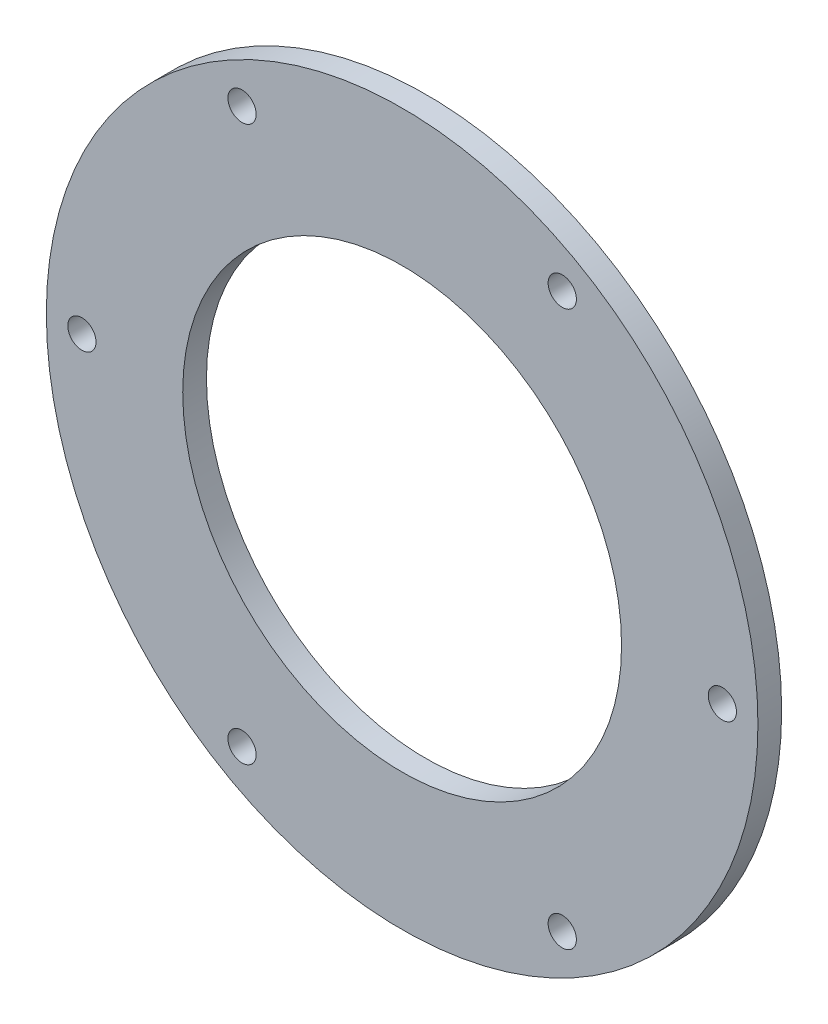
ISO-10303-21;
HEADER;
FILE_DESCRIPTION(('STEP AP214'),'2;1');
FILE_NAME('part.step','',(''),(''),'','','');
FILE_SCHEMA(('AUTOMOTIVE_DESIGN { 1 0 10303 214 1 1 1 1 }'));
ENDSEC;
DATA;
#1=APPLICATION_CONTEXT('core data for automotive mechanical design processes');
#2=APPLICATION_PROTOCOL_DEFINITION('international standard','automotive_design',2000,#1);
#3=PRODUCT_CONTEXT('',#1,'mechanical');
#4=PRODUCT('Part','Part','',(#3));
#5=PRODUCT_RELATED_PRODUCT_CATEGORY('part','',(#4));
#6=PRODUCT_DEFINITION_FORMATION('','',#4);
#7=PRODUCT_DEFINITION_CONTEXT('part definition',#1,'design');
#8=PRODUCT_DEFINITION('design','',#6,#7);
#9=PRODUCT_DEFINITION_SHAPE('','',#8);
#10=(LENGTH_UNIT() NAMED_UNIT(*) SI_UNIT(.MILLI.,.METRE.));
#11=(NAMED_UNIT(*) PLANE_ANGLE_UNIT() SI_UNIT($,.RADIAN.));
#12=(NAMED_UNIT(*) SI_UNIT($,.STERADIAN.) SOLID_ANGLE_UNIT());
#13=UNCERTAINTY_MEASURE_WITH_UNIT(LENGTH_MEASURE(1.E-05),#10,'distance_accuracy_value','');
#14=(GEOMETRIC_REPRESENTATION_CONTEXT(3) GLOBAL_UNCERTAINTY_ASSIGNED_CONTEXT((#13)) GLOBAL_UNIT_ASSIGNED_CONTEXT((#10,
#11,#12)) REPRESENTATION_CONTEXT('',''));
#15=CARTESIAN_POINT('',(0.,0.,0.));
#16=DIRECTION('',(0.,0.,1.));
#17=DIRECTION('',(1.,0.,0.));
#18=AXIS2_PLACEMENT_3D('',#15,#16,#17);
#19=CARTESIAN_POINT('',(0.,0.,4.));
#20=DIRECTION('',(0.,0.,1.));
#21=DIRECTION('',(1.,0.,0.));
#22=AXIS2_PLACEMENT_3D('',#19,#20,#21);
#23=PLANE('',#22);
#24=CARTESIAN_POINT('',(-54.,0.,4.));
#25=DIRECTION('',(0.,0.,1.));
#26=DIRECTION('',(1.,0.,0.));
#27=AXIS2_PLACEMENT_3D('',#24,#25,#26);
#28=CIRCLE('',#27,2.38125);
#29=CARTESIAN_POINT('',(-51.61875,0.,4.));
#30=VERTEX_POINT('',#29);
#31=EDGE_CURVE('E88',#30,#30,#28,.T.);
#32=ORIENTED_EDGE('',*,*,#31,.F.);
#33=EDGE_LOOP('',(#32));
#34=FACE_BOUND('',#33,.T.);
#35=CARTESIAN_POINT('',(54.,0.,4.));
#36=DIRECTION('',(0.,0.,1.));
#37=DIRECTION('',(1.,0.,0.));
#38=AXIS2_PLACEMENT_3D('',#35,#36,#37);
#39=CIRCLE('',#38,2.38125);
#40=CARTESIAN_POINT('',(56.38125,0.,4.));
#41=VERTEX_POINT('',#40);
#42=EDGE_CURVE('E82',#41,#41,#39,.T.);
#43=ORIENTED_EDGE('',*,*,#42,.F.);
#44=EDGE_LOOP('',(#43));
#45=FACE_BOUND('',#44,.T.);
#46=CARTESIAN_POINT('',(-26.9999999999999,46.7653718043597,4.));
#47=DIRECTION('',(0.,0.,1.));
#48=DIRECTION('',(1.,0.,0.));
#49=AXIS2_PLACEMENT_3D('',#46,#47,#48);
#50=CIRCLE('',#49,2.38125);
#51=CARTESIAN_POINT('',(-24.6187499999999,46.7653718043597,4.));
#52=VERTEX_POINT('',#51);
#53=EDGE_CURVE('E76',#52,#52,#50,.T.);
#54=ORIENTED_EDGE('',*,*,#53,.F.);
#55=EDGE_LOOP('',(#54));
#56=FACE_BOUND('',#55,.T.);
#57=CARTESIAN_POINT('',(-26.9999999999999,-46.7653718043598,4.));
#58=DIRECTION('',(0.,0.,1.));
#59=DIRECTION('',(1.,0.,0.));
#60=AXIS2_PLACEMENT_3D('',#57,#58,#59);
#61=CIRCLE('',#60,2.38125);
#62=CARTESIAN_POINT('',(-24.6187499999999,-46.7653718043598,4.));
#63=VERTEX_POINT('',#62);
#64=EDGE_CURVE('E70',#63,#63,#61,.T.);
#65=ORIENTED_EDGE('',*,*,#64,.F.);
#66=EDGE_LOOP('',(#65));
#67=FACE_BOUND('',#66,.T.);
#68=CARTESIAN_POINT('',(26.9999999999998,46.7653718043598,4.));
#69=DIRECTION('',(0.,0.,1.));
#70=DIRECTION('',(1.,0.,0.));
#71=AXIS2_PLACEMENT_3D('',#68,#69,#70);
#72=CIRCLE('',#71,2.38125);
#73=CARTESIAN_POINT('',(29.3812499999998,46.7653718043598,4.));
#74=VERTEX_POINT('',#73);
#75=EDGE_CURVE('E64',#74,#74,#72,.T.);
#76=ORIENTED_EDGE('',*,*,#75,.F.);
#77=EDGE_LOOP('',(#76));
#78=FACE_BOUND('',#77,.T.);
#79=CARTESIAN_POINT('',(26.9999999999998,-46.7653718043598,4.));
#80=DIRECTION('',(0.,0.,1.));
#81=DIRECTION('',(1.,0.,0.));
#82=AXIS2_PLACEMENT_3D('',#79,#80,#81);
#83=CIRCLE('',#82,2.38125);
#84=CARTESIAN_POINT('',(29.3812499999998,-46.7653718043598,4.));
#85=VERTEX_POINT('',#84);
#86=EDGE_CURVE('E58',#85,#85,#83,.T.);
#87=ORIENTED_EDGE('',*,*,#86,.F.);
#88=EDGE_LOOP('',(#87));
#89=FACE_BOUND('',#88,.T.);
#90=CARTESIAN_POINT('',(0.,0.,4.));
#91=DIRECTION('',(0.,0.,1.));
#92=DIRECTION('',(1.,0.,0.));
#93=AXIS2_PLACEMENT_3D('',#90,#91,#92);
#94=CIRCLE('',#93,60.);
#95=CARTESIAN_POINT('',(60.,0.,4.));
#96=VERTEX_POINT('',#95);
#97=EDGE_CURVE('E10',#96,#96,#94,.T.);
#98=ORIENTED_EDGE('',*,*,#97,.T.);
#99=EDGE_LOOP('',(#98));
#100=FACE_BOUND('',#99,.T.);
#101=CARTESIAN_POINT('',(0.,0.,4.));
#102=DIRECTION('',(0.,0.,1.));
#103=DIRECTION('',(1.,0.,0.));
#104=AXIS2_PLACEMENT_3D('',#101,#102,#103);
#105=CIRCLE('',#104,37.);
#106=CARTESIAN_POINT('',(37.,0.,4.));
#107=VERTEX_POINT('',#106);
#108=EDGE_CURVE('E48',#107,#107,#105,.T.);
#109=ORIENTED_EDGE('',*,*,#108,.F.);
#110=EDGE_LOOP('',(#109));
#111=FACE_BOUND('',#110,.T.);
#112=ADVANCED_FACE('F37',(#34,#45,#56,#67,#78,#89,#100,#111),#23,.T.);
#113=CARTESIAN_POINT('',(0.,0.,0.));
#114=DIRECTION('',(0.,0.,1.));
#115=DIRECTION('',(1.,0.,0.));
#116=AXIS2_PLACEMENT_3D('',#113,#114,#115);
#117=PLANE('',#116);
#118=CARTESIAN_POINT('',(-54.,0.,0.));
#119=DIRECTION('',(0.,0.,1.));
#120=DIRECTION('',(1.,0.,0.));
#121=AXIS2_PLACEMENT_3D('',#118,#119,#120);
#122=CIRCLE('',#121,2.38125);
#123=CARTESIAN_POINT('',(-51.61875,0.,0.));
#124=VERTEX_POINT('',#123);
#125=EDGE_CURVE('E85',#124,#124,#122,.T.);
#126=ORIENTED_EDGE('',*,*,#125,.T.);
#127=EDGE_LOOP('',(#126));
#128=FACE_BOUND('',#127,.T.);
#129=CARTESIAN_POINT('',(54.,0.,0.));
#130=DIRECTION('',(0.,0.,1.));
#131=DIRECTION('',(1.,0.,0.));
#132=AXIS2_PLACEMENT_3D('',#129,#130,#131);
#133=CIRCLE('',#132,2.38125);
#134=CARTESIAN_POINT('',(56.38125,0.,0.));
#135=VERTEX_POINT('',#134);
#136=EDGE_CURVE('E79',#135,#135,#133,.T.);
#137=ORIENTED_EDGE('',*,*,#136,.T.);
#138=EDGE_LOOP('',(#137));
#139=FACE_BOUND('',#138,.T.);
#140=CARTESIAN_POINT('',(-26.9999999999999,46.7653718043597,0.));
#141=DIRECTION('',(0.,0.,1.));
#142=DIRECTION('',(1.,0.,0.));
#143=AXIS2_PLACEMENT_3D('',#140,#141,#142);
#144=CIRCLE('',#143,2.38125);
#145=CARTESIAN_POINT('',(-24.6187499999999,46.7653718043597,0.));
#146=VERTEX_POINT('',#145);
#147=EDGE_CURVE('E73',#146,#146,#144,.T.);
#148=ORIENTED_EDGE('',*,*,#147,.T.);
#149=EDGE_LOOP('',(#148));
#150=FACE_BOUND('',#149,.T.);
#151=CARTESIAN_POINT('',(-26.9999999999999,-46.7653718043598,0.));
#152=DIRECTION('',(0.,0.,1.));
#153=DIRECTION('',(1.,0.,0.));
#154=AXIS2_PLACEMENT_3D('',#151,#152,#153);
#155=CIRCLE('',#154,2.38125);
#156=CARTESIAN_POINT('',(-24.6187499999999,-46.7653718043598,0.));
#157=VERTEX_POINT('',#156);
#158=EDGE_CURVE('E67',#157,#157,#155,.T.);
#159=ORIENTED_EDGE('',*,*,#158,.T.);
#160=EDGE_LOOP('',(#159));
#161=FACE_BOUND('',#160,.T.);
#162=CARTESIAN_POINT('',(26.9999999999998,46.7653718043598,0.));
#163=DIRECTION('',(0.,0.,1.));
#164=DIRECTION('',(1.,0.,0.));
#165=AXIS2_PLACEMENT_3D('',#162,#163,#164);
#166=CIRCLE('',#165,2.38125);
#167=CARTESIAN_POINT('',(29.3812499999998,46.7653718043598,0.));
#168=VERTEX_POINT('',#167);
#169=EDGE_CURVE('E61',#168,#168,#166,.T.);
#170=ORIENTED_EDGE('',*,*,#169,.T.);
#171=EDGE_LOOP('',(#170));
#172=FACE_BOUND('',#171,.T.);
#173=CARTESIAN_POINT('',(26.9999999999998,-46.7653718043598,0.));
#174=DIRECTION('',(0.,0.,1.));
#175=DIRECTION('',(1.,0.,0.));
#176=AXIS2_PLACEMENT_3D('',#173,#174,#175);
#177=CIRCLE('',#176,2.38125);
#178=CARTESIAN_POINT('',(29.3812499999998,-46.7653718043598,0.));
#179=VERTEX_POINT('',#178);
#180=EDGE_CURVE('E53',#179,#179,#177,.T.);
#181=ORIENTED_EDGE('',*,*,#180,.T.);
#182=EDGE_LOOP('',(#181));
#183=FACE_BOUND('',#182,.T.);
#184=CARTESIAN_POINT('',(0.,0.,0.));
#185=DIRECTION('',(0.,0.,1.));
#186=DIRECTION('',(1.,0.,0.));
#187=AXIS2_PLACEMENT_3D('',#184,#185,#186);
#188=CIRCLE('',#187,60.);
#189=CARTESIAN_POINT('',(60.,0.,0.));
#190=VERTEX_POINT('',#189);
#191=EDGE_CURVE('E41',#190,#190,#188,.T.);
#192=ORIENTED_EDGE('',*,*,#191,.F.);
#193=EDGE_LOOP('',(#192));
#194=FACE_BOUND('',#193,.T.);
#195=CARTESIAN_POINT('',(0.,0.,0.));
#196=DIRECTION('',(0.,0.,1.));
#197=DIRECTION('',(1.,0.,0.));
#198=AXIS2_PLACEMENT_3D('',#195,#196,#197);
#199=CIRCLE('',#198,37.);
#200=CARTESIAN_POINT('',(37.,0.,0.));
#201=VERTEX_POINT('',#200);
#202=EDGE_CURVE('E50',#201,#201,#199,.T.);
#203=ORIENTED_EDGE('',*,*,#202,.T.);
#204=EDGE_LOOP('',(#203));
#205=FACE_BOUND('',#204,.T.);
#206=ADVANCED_FACE('F96',(#128,#139,#150,#161,#172,#183,#194,#205),#117,.F.);
#207=CARTESIAN_POINT('',(0.,0.,4.));
#208=DIRECTION('',(0.,0.,-1.));
#209=DIRECTION('',(-1.,0.,0.));
#210=AXIS2_PLACEMENT_3D('',#207,#208,#209);
#211=CYLINDRICAL_SURFACE('',#210,60.);
#212=ORIENTED_EDGE('',*,*,#97,.F.);
#213=EDGE_LOOP('',(#212));
#214=FACE_BOUND('',#213,.T.);
#215=ORIENTED_EDGE('',*,*,#191,.T.);
#216=EDGE_LOOP('',(#215));
#217=FACE_BOUND('',#216,.T.);
#218=ADVANCED_FACE('F39',(#214,#217),#211,.T.);
#219=CARTESIAN_POINT('',(0.,0.,4.));
#220=DIRECTION('',(0.,0.,-1.));
#221=DIRECTION('',(-1.,0.,0.));
#222=AXIS2_PLACEMENT_3D('',#219,#220,#221);
#223=CYLINDRICAL_SURFACE('',#222,37.);
#224=ORIENTED_EDGE('',*,*,#108,.T.);
#225=EDGE_LOOP('',(#224));
#226=FACE_BOUND('',#225,.T.);
#227=ORIENTED_EDGE('',*,*,#202,.F.);
#228=EDGE_LOOP('',(#227));
#229=FACE_BOUND('',#228,.T.);
#230=ADVANCED_FACE('F110',(#226,#229),#223,.F.);
#231=CARTESIAN_POINT('',(26.9999999999998,-46.7653718043598,4.));
#232=DIRECTION('',(0.,0.,1.));
#233=DIRECTION('',(1.,0.,0.));
#234=AXIS2_PLACEMENT_3D('',#231,#232,#233);
#235=CYLINDRICAL_SURFACE('',#234,2.38125);
#236=ORIENTED_EDGE('',*,*,#180,.F.);
#237=EDGE_LOOP('',(#236));
#238=FACE_BOUND('',#237,.T.);
#239=ORIENTED_EDGE('',*,*,#86,.T.);
#240=EDGE_LOOP('',(#239));
#241=FACE_BOUND('',#240,.T.);
#242=ADVANCED_FACE('F113',(#238,#241),#235,.F.);
#243=CARTESIAN_POINT('',(26.9999999999998,46.7653718043598,4.));
#244=DIRECTION('',(0.,0.,1.));
#245=DIRECTION('',(1.,0.,0.));
#246=AXIS2_PLACEMENT_3D('',#243,#244,#245);
#247=CYLINDRICAL_SURFACE('',#246,2.38125);
#248=ORIENTED_EDGE('',*,*,#169,.F.);
#249=EDGE_LOOP('',(#248));
#250=FACE_BOUND('',#249,.T.);
#251=ORIENTED_EDGE('',*,*,#75,.T.);
#252=EDGE_LOOP('',(#251));
#253=FACE_BOUND('',#252,.T.);
#254=ADVANCED_FACE('F127',(#250,#253),#247,.F.);
#255=CARTESIAN_POINT('',(-26.9999999999999,-46.7653718043598,4.));
#256=DIRECTION('',(0.,0.,1.));
#257=DIRECTION('',(1.,0.,0.));
#258=AXIS2_PLACEMENT_3D('',#255,#256,#257);
#259=CYLINDRICAL_SURFACE('',#258,2.38125);
#260=ORIENTED_EDGE('',*,*,#158,.F.);
#261=EDGE_LOOP('',(#260));
#262=FACE_BOUND('',#261,.T.);
#263=ORIENTED_EDGE('',*,*,#64,.T.);
#264=EDGE_LOOP('',(#263));
#265=FACE_BOUND('',#264,.T.);
#266=ADVANCED_FACE('F131',(#262,#265),#259,.F.);
#267=CARTESIAN_POINT('',(-26.9999999999999,46.7653718043597,4.));
#268=DIRECTION('',(0.,0.,1.));
#269=DIRECTION('',(1.,0.,0.));
#270=AXIS2_PLACEMENT_3D('',#267,#268,#269);
#271=CYLINDRICAL_SURFACE('',#270,2.38125);
#272=ORIENTED_EDGE('',*,*,#147,.F.);
#273=EDGE_LOOP('',(#272));
#274=FACE_BOUND('',#273,.T.);
#275=ORIENTED_EDGE('',*,*,#53,.T.);
#276=EDGE_LOOP('',(#275));
#277=FACE_BOUND('',#276,.T.);
#278=ADVANCED_FACE('F135',(#274,#277),#271,.F.);
#279=CARTESIAN_POINT('',(54.,0.,4.));
#280=DIRECTION('',(0.,0.,1.));
#281=DIRECTION('',(1.,0.,0.));
#282=AXIS2_PLACEMENT_3D('',#279,#280,#281);
#283=CYLINDRICAL_SURFACE('',#282,2.38125);
#284=ORIENTED_EDGE('',*,*,#136,.F.);
#285=EDGE_LOOP('',(#284));
#286=FACE_BOUND('',#285,.T.);
#287=ORIENTED_EDGE('',*,*,#42,.T.);
#288=EDGE_LOOP('',(#287));
#289=FACE_BOUND('',#288,.T.);
#290=ADVANCED_FACE('F139',(#286,#289),#283,.F.);
#291=CARTESIAN_POINT('',(-54.,0.,4.));
#292=DIRECTION('',(0.,0.,1.));
#293=DIRECTION('',(1.,0.,0.));
#294=AXIS2_PLACEMENT_3D('',#291,#292,#293);
#295=CYLINDRICAL_SURFACE('',#294,2.38125);
#296=ORIENTED_EDGE('',*,*,#125,.F.);
#297=EDGE_LOOP('',(#296));
#298=FACE_BOUND('',#297,.T.);
#299=ORIENTED_EDGE('',*,*,#31,.T.);
#300=EDGE_LOOP('',(#299));
#301=FACE_BOUND('',#300,.T.);
#302=ADVANCED_FACE('F92',(#298,#301),#295,.F.);
#303=CLOSED_SHELL('',(#112,#206,#218,#230,#242,#254,#266,#278,#290,#302));
#304=MANIFOLD_SOLID_BREP('B2',#303);
#305=ADVANCED_BREP_SHAPE_REPRESENTATION('',(#18,#304),#14);
#306=SHAPE_DEFINITION_REPRESENTATION(#9,#305);
ENDSEC;
END-ISO-10303-21;
